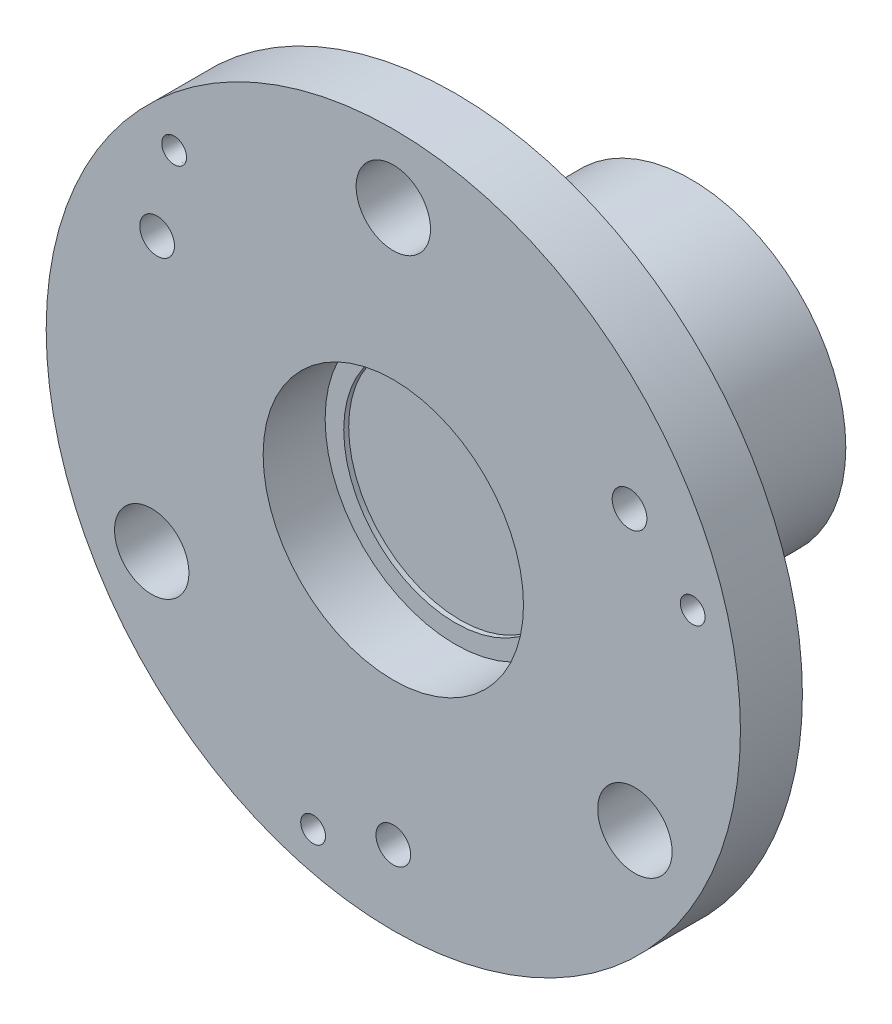
ISO-10303-21;
HEADER;
FILE_DESCRIPTION(('STEP AP214'),'2;1');
FILE_NAME('part.step','',(''),(''),'','','');
FILE_SCHEMA(('AUTOMOTIVE_DESIGN { 1 0 10303 214 1 1 1 1 }'));
ENDSEC;
DATA;
#1=APPLICATION_CONTEXT('core data for automotive mechanical design processes');
#2=APPLICATION_PROTOCOL_DEFINITION('international standard','automotive_design',2000,#1);
#3=PRODUCT_CONTEXT('',#1,'mechanical');
#4=PRODUCT('Part','Part','',(#3));
#5=PRODUCT_RELATED_PRODUCT_CATEGORY('part','',(#4));
#6=PRODUCT_DEFINITION_FORMATION('','',#4);
#7=PRODUCT_DEFINITION_CONTEXT('part definition',#1,'design');
#8=PRODUCT_DEFINITION('design','',#6,#7);
#9=PRODUCT_DEFINITION_SHAPE('','',#8);
#10=(LENGTH_UNIT() NAMED_UNIT(*) SI_UNIT(.MILLI.,.METRE.));
#11=(NAMED_UNIT(*) PLANE_ANGLE_UNIT() SI_UNIT($,.RADIAN.));
#12=(NAMED_UNIT(*) SI_UNIT($,.STERADIAN.) SOLID_ANGLE_UNIT());
#13=UNCERTAINTY_MEASURE_WITH_UNIT(LENGTH_MEASURE(1.E-05),#10,'distance_accuracy_value','');
#14=(GEOMETRIC_REPRESENTATION_CONTEXT(3) GLOBAL_UNCERTAINTY_ASSIGNED_CONTEXT((#13)) GLOBAL_UNIT_ASSIGNED_CONTEXT((#10,
#11,#12)) REPRESENTATION_CONTEXT('',''));
#15=CARTESIAN_POINT('',(0.,0.,0.));
#16=DIRECTION('',(0.,0.,1.));
#17=DIRECTION('',(1.,0.,0.));
#18=AXIS2_PLACEMENT_3D('',#15,#16,#17);
#19=CARTESIAN_POINT('',(0.,0.,-9.));
#20=DIRECTION('',(0.,0.,-1.));
#21=DIRECTION('',(0.,-1.,0.));
#22=AXIS2_PLACEMENT_3D('',#19,#20,#21);
#23=PLANE('',#22);
#24=CARTESIAN_POINT('',(0.,-7.,-9.));
#25=DIRECTION('',(0.,0.,-1.));
#26=DIRECTION('',(-1.,0.,0.));
#27=AXIS2_PLACEMENT_3D('',#24,#25,#26);
#28=CIRCLE('',#27,2.1);
#29=CARTESIAN_POINT('',(-2.1,-7.,-9.));
#30=VERTEX_POINT('',#29);
#31=EDGE_CURVE('E11',#30,#30,#28,.T.);
#32=ORIENTED_EDGE('',*,*,#31,.T.);
#33=EDGE_LOOP('',(#32));
#34=FACE_BOUND('',#33,.T.);
#35=ADVANCED_FACE('F17',(#34),#23,.T.);
#36=CARTESIAN_POINT('',(0.,-7.,-9.));
#37=DIRECTION('',(0.,0.,-1.));
#38=DIRECTION('',(-1.,0.,0.));
#39=AXIS2_PLACEMENT_3D('',#36,#37,#38);
#40=CYLINDRICAL_SURFACE('',#39,2.1);
#41=CARTESIAN_POINT('',(0.,-7.,-19.));
#42=DIRECTION('',(0.,0.,-1.));
#43=DIRECTION('',(-1.,0.,0.));
#44=AXIS2_PLACEMENT_3D('',#41,#42,#43);
#45=CIRCLE('',#44,2.1);
#46=CARTESIAN_POINT('',(-2.1,-7.,-19.));
#47=VERTEX_POINT('',#46);
#48=EDGE_CURVE('E274',#47,#47,#45,.T.);
#49=ORIENTED_EDGE('',*,*,#48,.T.);
#50=EDGE_LOOP('',(#49));
#51=FACE_BOUND('',#50,.T.);
#52=ORIENTED_EDGE('',*,*,#31,.F.);
#53=EDGE_LOOP('',(#52));
#54=FACE_BOUND('',#53,.T.);
#55=ADVANCED_FACE('F327',(#51,#54),#40,.F.);
#56=CARTESIAN_POINT('',(0.,0.,-9.));
#57=DIRECTION('',(0.,0.,-1.));
#58=DIRECTION('',(0.,-1.,0.));
#59=AXIS2_PLACEMENT_3D('',#56,#57,#58);
#60=PLANE('',#59);
#61=CARTESIAN_POINT('',(-7.,0.,-9.));
#62=DIRECTION('',(0.,0.,-1.));
#63=DIRECTION('',(-1.,0.,0.));
#64=AXIS2_PLACEMENT_3D('',#61,#62,#63);
#65=CIRCLE('',#64,2.1);
#66=CARTESIAN_POINT('',(-9.1,0.,-9.));
#67=VERTEX_POINT('',#66);
#68=EDGE_CURVE('E27',#67,#67,#65,.T.);
#69=ORIENTED_EDGE('',*,*,#68,.T.);
#70=EDGE_LOOP('',(#69));
#71=FACE_BOUND('',#70,.T.);
#72=ADVANCED_FACE('F333',(#71),#60,.T.);
#73=CARTESIAN_POINT('',(-7.,0.,-9.));
#74=DIRECTION('',(0.,0.,-1.));
#75=DIRECTION('',(-1.,0.,0.));
#76=AXIS2_PLACEMENT_3D('',#73,#74,#75);
#77=CYLINDRICAL_SURFACE('',#76,2.1);
#78=CARTESIAN_POINT('',(-7.,0.,-19.));
#79=DIRECTION('',(0.,0.,-1.));
#80=DIRECTION('',(-1.,0.,0.));
#81=AXIS2_PLACEMENT_3D('',#78,#79,#80);
#82=CIRCLE('',#81,2.1);
#83=CARTESIAN_POINT('',(-9.1,0.,-19.));
#84=VERTEX_POINT('',#83);
#85=EDGE_CURVE('E280',#84,#84,#82,.T.);
#86=ORIENTED_EDGE('',*,*,#85,.T.);
#87=EDGE_LOOP('',(#86));
#88=FACE_BOUND('',#87,.T.);
#89=ORIENTED_EDGE('',*,*,#68,.F.);
#90=EDGE_LOOP('',(#89));
#91=FACE_BOUND('',#90,.T.);
#92=ADVANCED_FACE('F552',(#88,#91),#77,.F.);
#93=CARTESIAN_POINT('',(0.,0.,-9.));
#94=DIRECTION('',(0.,0.,-1.));
#95=DIRECTION('',(0.,-1.,0.));
#96=AXIS2_PLACEMENT_3D('',#93,#94,#95);
#97=PLANE('',#96);
#98=CARTESIAN_POINT('',(0.,7.,-9.));
#99=DIRECTION('',(0.,0.,-1.));
#100=DIRECTION('',(-1.,0.,0.));
#101=AXIS2_PLACEMENT_3D('',#98,#99,#100);
#102=CIRCLE('',#101,2.1);
#103=CARTESIAN_POINT('',(-2.1,7.,-9.));
#104=VERTEX_POINT('',#103);
#105=EDGE_CURVE('E251',#104,#104,#102,.T.);
#106=ORIENTED_EDGE('',*,*,#105,.T.);
#107=EDGE_LOOP('',(#106));
#108=FACE_BOUND('',#107,.T.);
#109=ADVANCED_FACE('F573',(#108),#97,.T.);
#110=CARTESIAN_POINT('',(0.,7.,-9.));
#111=DIRECTION('',(0.,0.,-1.));
#112=DIRECTION('',(-1.,0.,0.));
#113=AXIS2_PLACEMENT_3D('',#110,#111,#112);
#114=CYLINDRICAL_SURFACE('',#113,2.1);
#115=CARTESIAN_POINT('',(0.,7.,-19.));
#116=DIRECTION('',(0.,0.,-1.));
#117=DIRECTION('',(-1.,0.,0.));
#118=AXIS2_PLACEMENT_3D('',#115,#116,#117);
#119=CIRCLE('',#118,2.1);
#120=CARTESIAN_POINT('',(-2.1,7.,-19.));
#121=VERTEX_POINT('',#120);
#122=EDGE_CURVE('E283',#121,#121,#119,.T.);
#123=ORIENTED_EDGE('',*,*,#122,.T.);
#124=EDGE_LOOP('',(#123));
#125=FACE_BOUND('',#124,.T.);
#126=ORIENTED_EDGE('',*,*,#105,.F.);
#127=EDGE_LOOP('',(#126));
#128=FACE_BOUND('',#127,.T.);
#129=ADVANCED_FACE('F393',(#125,#128),#114,.F.);
#130=CARTESIAN_POINT('',(0.,0.,-9.));
#131=DIRECTION('',(0.,0.,-1.));
#132=DIRECTION('',(0.,-1.,0.));
#133=AXIS2_PLACEMENT_3D('',#130,#131,#132);
#134=PLANE('',#133);
#135=CARTESIAN_POINT('',(7.,0.,-9.));
#136=DIRECTION('',(0.,0.,-1.));
#137=DIRECTION('',(-1.,0.,0.));
#138=AXIS2_PLACEMENT_3D('',#135,#136,#137);
#139=CIRCLE('',#138,2.1);
#140=CARTESIAN_POINT('',(4.9,0.,-9.));
#141=VERTEX_POINT('',#140);
#142=EDGE_CURVE('E877',#141,#141,#139,.T.);
#143=ORIENTED_EDGE('',*,*,#142,.T.);
#144=EDGE_LOOP('',(#143));
#145=FACE_BOUND('',#144,.T.);
#146=ADVANCED_FACE('F537',(#145),#134,.T.);
#147=CARTESIAN_POINT('',(7.,0.,-9.));
#148=DIRECTION('',(0.,0.,-1.));
#149=DIRECTION('',(-1.,0.,0.));
#150=AXIS2_PLACEMENT_3D('',#147,#148,#149);
#151=CYLINDRICAL_SURFACE('',#150,2.1);
#152=CARTESIAN_POINT('',(7.,0.,-19.));
#153=DIRECTION('',(0.,0.,-1.));
#154=DIRECTION('',(-1.,0.,0.));
#155=AXIS2_PLACEMENT_3D('',#152,#153,#154);
#156=CIRCLE('',#155,2.1);
#157=CARTESIAN_POINT('',(4.9,0.,-19.));
#158=VERTEX_POINT('',#157);
#159=EDGE_CURVE('E424',#158,#158,#156,.T.);
#160=ORIENTED_EDGE('',*,*,#159,.T.);
#161=EDGE_LOOP('',(#160));
#162=FACE_BOUND('',#161,.T.);
#163=ORIENTED_EDGE('',*,*,#142,.F.);
#164=EDGE_LOOP('',(#163));
#165=FACE_BOUND('',#164,.T.);
#166=ADVANCED_FACE('F532',(#162,#165),#151,.F.);
#167=CARTESIAN_POINT('',(0.,0.,-19.));
#168=DIRECTION('',(0.,0.,-1.));
#169=DIRECTION('',(0.,-1.,0.));
#170=AXIS2_PLACEMENT_3D('',#167,#168,#169);
#171=PLANE('',#170);
#172=CARTESIAN_POINT('',(0.,0.,-19.));
#173=DIRECTION('',(0.,0.,-1.));
#174=DIRECTION('',(-1.,0.,0.));
#175=AXIS2_PLACEMENT_3D('',#172,#173,#174);
#176=CIRCLE('',#175,12.5);
#177=CARTESIAN_POINT('',(-12.5,0.,-19.));
#178=VERTEX_POINT('',#177);
#179=EDGE_CURVE('E257',#178,#178,#176,.T.);
#180=ORIENTED_EDGE('',*,*,#179,.T.);
#181=EDGE_LOOP('',(#180));
#182=FACE_BOUND('',#181,.T.);
#183=ORIENTED_EDGE('',*,*,#159,.F.);
#184=EDGE_LOOP('',(#183));
#185=FACE_BOUND('',#184,.T.);
#186=ORIENTED_EDGE('',*,*,#122,.F.);
#187=EDGE_LOOP('',(#186));
#188=FACE_BOUND('',#187,.T.);
#189=ORIENTED_EDGE('',*,*,#85,.F.);
#190=EDGE_LOOP('',(#189));
#191=FACE_BOUND('',#190,.T.);
#192=ORIENTED_EDGE('',*,*,#48,.F.);
#193=EDGE_LOOP('',(#192));
#194=FACE_BOUND('',#193,.T.);
#195=ADVANCED_FACE('F379',(#182,#185,#188,#191,#194),#171,.T.);
#196=CARTESIAN_POINT('',(0.,0.,-19.));
#197=DIRECTION('',(0.,0.,1.));
#198=DIRECTION('',(1.,0.,0.));
#199=AXIS2_PLACEMENT_3D('',#196,#197,#198);
#200=CYLINDRICAL_SURFACE('',#199,12.5);
#201=CARTESIAN_POINT('',(0.,0.,-4.));
#202=DIRECTION('',(0.,0.,-1.));
#203=DIRECTION('',(-1.,0.,0.));
#204=AXIS2_PLACEMENT_3D('',#201,#202,#203);
#205=CIRCLE('',#204,12.5);
#206=CARTESIAN_POINT('',(-12.5,0.,-4.));
#207=VERTEX_POINT('',#206);
#208=EDGE_CURVE('E220',#207,#207,#205,.T.);
#209=ORIENTED_EDGE('',*,*,#208,.T.);
#210=EDGE_LOOP('',(#209));
#211=FACE_BOUND('',#210,.T.);
#212=ORIENTED_EDGE('',*,*,#179,.F.);
#213=EDGE_LOOP('',(#212));
#214=FACE_BOUND('',#213,.T.);
#215=ADVANCED_FACE('F221',(#211,#214),#200,.T.);
#216=CARTESIAN_POINT('',(0.,0.,-0.4));
#217=DIRECTION('',(0.,0.,1.));
#218=DIRECTION('',(1.,0.,0.));
#219=AXIS2_PLACEMENT_3D('',#216,#217,#218);
#220=PLANE('',#219);
#221=CARTESIAN_POINT('',(0.,0.,-0.4));
#222=DIRECTION('',(0.,0.,-1.));
#223=DIRECTION('',(1.,0.,0.));
#224=AXIS2_PLACEMENT_3D('',#221,#222,#223);
#225=CIRCLE('',#224,9.);
#226=CARTESIAN_POINT('',(9.,0.,-0.4));
#227=VERTEX_POINT('',#226);
#228=EDGE_CURVE('E254',#227,#227,#225,.T.);
#229=ORIENTED_EDGE('',*,*,#228,.F.);
#230=EDGE_LOOP('',(#229));
#231=FACE_BOUND('',#230,.T.);
#232=ADVANCED_FACE('F362',(#231),#220,.T.);
#233=CARTESIAN_POINT('',(0.,0.,0.));
#234=DIRECTION('',(0.,0.,1.));
#235=DIRECTION('',(1.,0.,0.));
#236=AXIS2_PLACEMENT_3D('',#233,#234,#235);
#237=PLANE('',#236);
#238=CARTESIAN_POINT('',(0.,0.,0.));
#239=DIRECTION('',(0.,0.,1.));
#240=DIRECTION('',(1.,0.,0.));
#241=AXIS2_PLACEMENT_3D('',#238,#239,#240);
#242=CIRCLE('',#241,10.5);
#243=CARTESIAN_POINT('',(10.5,0.,0.));
#244=VERTEX_POINT('',#243);
#245=EDGE_CURVE('E213',#244,#244,#242,.T.);
#246=ORIENTED_EDGE('',*,*,#245,.T.);
#247=EDGE_LOOP('',(#246));
#248=FACE_BOUND('',#247,.T.);
#249=CARTESIAN_POINT('',(0.,0.,0.));
#250=DIRECTION('',(0.,0.,1.));
#251=DIRECTION('',(1.,0.,0.));
#252=AXIS2_PLACEMENT_3D('',#249,#250,#251);
#253=CIRCLE('',#252,9.);
#254=CARTESIAN_POINT('',(9.,0.,0.));
#255=VERTEX_POINT('',#254);
#256=EDGE_CURVE('E231',#255,#255,#253,.T.);
#257=ORIENTED_EDGE('',*,*,#256,.F.);
#258=EDGE_LOOP('',(#257));
#259=FACE_BOUND('',#258,.T.);
#260=ADVANCED_FACE('F321',(#248,#259),#237,.T.);
#261=CARTESIAN_POINT('',(0.,0.,0.));
#262=DIRECTION('',(0.,0.,-1.));
#263=DIRECTION('',(-1.,0.,0.));
#264=AXIS2_PLACEMENT_3D('',#261,#262,#263);
#265=CYLINDRICAL_SURFACE('',#264,9.);
#266=ORIENTED_EDGE('',*,*,#228,.T.);
#267=EDGE_LOOP('',(#266));
#268=FACE_BOUND('',#267,.T.);
#269=ORIENTED_EDGE('',*,*,#256,.T.);
#270=EDGE_LOOP('',(#269));
#271=FACE_BOUND('',#270,.T.);
#272=ADVANCED_FACE('F310',(#268,#271),#265,.F.);
#273=CARTESIAN_POINT('',(0.,0.,-2.));
#274=DIRECTION('',(0.,0.,1.));
#275=DIRECTION('',(1.,0.,0.));
#276=AXIS2_PLACEMENT_3D('',#273,#274,#275);
#277=CONICAL_SURFACE('',#276,14.5,0.785398163397448);
#278=CARTESIAN_POINT('',(0.,0.,-2.));
#279=DIRECTION('',(0.,0.,-1.));
#280=DIRECTION('',(1.,0.,0.));
#281=AXIS2_PLACEMENT_3D('',#278,#279,#280);
#282=CIRCLE('',#281,14.5);
#283=CARTESIAN_POINT('',(14.5,0.,-2.));
#284=VERTEX_POINT('',#283);
#285=EDGE_CURVE('E141',#284,#284,#282,.T.);
#286=ORIENTED_EDGE('',*,*,#285,.F.);
#287=EDGE_LOOP('',(#286));
#288=FACE_BOUND('',#287,.T.);
#289=CARTESIAN_POINT('',(0.,0.,0.));
#290=DIRECTION('',(0.,0.,1.));
#291=DIRECTION('',(1.,0.,0.));
#292=AXIS2_PLACEMENT_3D('',#289,#290,#291);
#293=CIRCLE('',#292,16.5);
#294=CARTESIAN_POINT('',(16.5,0.,0.));
#295=VERTEX_POINT('',#294);
#296=EDGE_CURVE('E291',#295,#295,#293,.T.);
#297=ORIENTED_EDGE('',*,*,#296,.F.);
#298=EDGE_LOOP('',(#297));
#299=FACE_BOUND('',#298,.T.);
#300=ADVANCED_FACE('F307',(#288,#299),#277,.T.);
#301=CARTESIAN_POINT('',(0.,0.,-0.4));
#302=DIRECTION('',(0.,0.,1.));
#303=DIRECTION('',(1.,0.,0.));
#304=AXIS2_PLACEMENT_3D('',#301,#302,#303);
#305=CYLINDRICAL_SURFACE('',#304,10.5);
#306=CARTESIAN_POINT('',(0.,0.,5.));
#307=DIRECTION('',(0.,0.,1.));
#308=DIRECTION('',(1.,0.,0.));
#309=AXIS2_PLACEMENT_3D('',#306,#307,#308);
#310=CIRCLE('',#309,10.5);
#311=CARTESIAN_POINT('',(10.5,0.,5.));
#312=VERTEX_POINT('',#311);
#313=EDGE_CURVE('E79',#312,#312,#310,.T.);
#314=ORIENTED_EDGE('',*,*,#313,.T.);
#315=EDGE_LOOP('',(#314));
#316=FACE_BOUND('',#315,.T.);
#317=ORIENTED_EDGE('',*,*,#245,.F.);
#318=EDGE_LOOP('',(#317));
#319=FACE_BOUND('',#318,.T.);
#320=ADVANCED_FACE('F309',(#316,#319),#305,.F.);
#321=CARTESIAN_POINT('',(0.,0.,-4.));
#322=DIRECTION('',(0.,0.,-1.));
#323=DIRECTION('',(0.,-1.,0.));
#324=AXIS2_PLACEMENT_3D('',#321,#322,#323);
#325=PLANE('',#324);
#326=CARTESIAN_POINT('',(0.,0.,-4.));
#327=DIRECTION('',(0.,0.,-1.));
#328=DIRECTION('',(-1.,0.,0.));
#329=AXIS2_PLACEMENT_3D('',#326,#327,#328);
#330=CIRCLE('',#329,14.5);
#331=CARTESIAN_POINT('',(-14.5,0.,-4.));
#332=VERTEX_POINT('',#331);
#333=EDGE_CURVE('E21',#332,#332,#330,.T.);
#334=ORIENTED_EDGE('',*,*,#333,.T.);
#335=EDGE_LOOP('',(#334));
#336=FACE_BOUND('',#335,.T.);
#337=ORIENTED_EDGE('',*,*,#208,.F.);
#338=EDGE_LOOP('',(#337));
#339=FACE_BOUND('',#338,.T.);
#340=ADVANCED_FACE('F319',(#336,#339),#325,.T.);
#341=CARTESIAN_POINT('',(0.,0.,-4.));
#342=DIRECTION('',(0.,0.,1.));
#343=DIRECTION('',(1.,0.,0.));
#344=AXIS2_PLACEMENT_3D('',#341,#342,#343);
#345=CYLINDRICAL_SURFACE('',#344,14.5);
#346=ORIENTED_EDGE('',*,*,#333,.F.);
#347=EDGE_LOOP('',(#346));
#348=FACE_BOUND('',#347,.T.);
#349=ORIENTED_EDGE('',*,*,#285,.T.);
#350=EDGE_LOOP('',(#349));
#351=FACE_BOUND('',#350,.T.);
#352=ADVANCED_FACE('F360',(#348,#351),#345,.T.);
#353=CARTESIAN_POINT('',(3.23523806378151,-4.66116523516815,2.8));
#354=DIRECTION('',(0.,0.,-1.));
#355=DIRECTION('',(0.,-1.,0.));
#356=AXIS2_PLACEMENT_3D('',#353,#354,#355);
#357=PLANE('',#356);
#358=CARTESIAN_POINT('',(-17.6776695296637,17.6776695296637,2.8));
#359=DIRECTION('',(0.,0.,-1.));
#360=DIRECTION('',(-1.,0.,0.));
#361=AXIS2_PLACEMENT_3D('',#358,#359,#360);
#362=CIRCLE('',#361,0.532375564325952);
#363=CARTESIAN_POINT('',(-18.2100450939897,17.6776695296637,2.8));
#364=VERTEX_POINT('',#363);
#365=EDGE_CURVE('E154',#364,#364,#362,.T.);
#366=ORIENTED_EDGE('',*,*,#365,.F.);
#367=EDGE_LOOP('',(#366));
#368=FACE_BOUND('',#367,.T.);
#369=ADVANCED_FACE('F356',(#368),#357,.F.);
#370=CARTESIAN_POINT('',(-17.6776695296637,17.6776695296637,5.));
#371=DIRECTION('',(0.,0.,1.));
#372=DIRECTION('',(-1.,0.,0.));
#373=AXIS2_PLACEMENT_3D('',#370,#371,#372);
#374=CONICAL_SURFACE('',#373,1.,0.20943951023932);
#375=CARTESIAN_POINT('',(-17.6776695296637,17.6776695296637,5.));
#376=DIRECTION('',(0.,0.,-1.));
#377=DIRECTION('',(-1.,0.,0.));
#378=AXIS2_PLACEMENT_3D('',#375,#376,#377);
#379=CIRCLE('',#378,1.);
#380=CARTESIAN_POINT('',(-18.6776695296637,17.6776695296637,5.));
#381=VERTEX_POINT('',#380);
#382=EDGE_CURVE('E69',#381,#381,#379,.T.);
#383=ORIENTED_EDGE('',*,*,#382,.F.);
#384=EDGE_LOOP('',(#383));
#385=FACE_BOUND('',#384,.T.);
#386=ORIENTED_EDGE('',*,*,#365,.T.);
#387=EDGE_LOOP('',(#386));
#388=FACE_BOUND('',#387,.T.);
#389=ADVANCED_FACE('F359',(#385,#388),#374,.F.);
#390=CARTESIAN_POINT('',(3.23523806378151,-4.66116523516815,2.8));
#391=DIRECTION('',(0.,0.,-1.));
#392=DIRECTION('',(0.,-1.,0.));
#393=AXIS2_PLACEMENT_3D('',#390,#391,#392);
#394=PLANE('',#393);
#395=CARTESIAN_POINT('',(24.1481456572267,6.47047612756302,2.8));
#396=DIRECTION('',(0.,0.,-1.));
#397=DIRECTION('',(-1.,0.,0.));
#398=AXIS2_PLACEMENT_3D('',#395,#396,#397);
#399=CIRCLE('',#398,0.532375564325951);
#400=CARTESIAN_POINT('',(23.6157700929007,6.47047612756302,2.8));
#401=VERTEX_POINT('',#400);
#402=EDGE_CURVE('E269',#401,#401,#399,.T.);
#403=ORIENTED_EDGE('',*,*,#402,.F.);
#404=EDGE_LOOP('',(#403));
#405=FACE_BOUND('',#404,.T.);
#406=ADVANCED_FACE('F354',(#405),#394,.F.);
#407=CARTESIAN_POINT('',(24.1481456572267,6.47047612756302,5.));
#408=DIRECTION('',(0.,0.,1.));
#409=DIRECTION('',(-1.,0.,0.));
#410=AXIS2_PLACEMENT_3D('',#407,#408,#409);
#411=CONICAL_SURFACE('',#410,1.,0.20943951023932);
#412=CARTESIAN_POINT('',(24.1481456572267,6.47047612756302,5.));
#413=DIRECTION('',(0.,0.,-1.));
#414=DIRECTION('',(-1.,0.,0.));
#415=AXIS2_PLACEMENT_3D('',#412,#413,#414);
#416=CIRCLE('',#415,1.);
#417=CARTESIAN_POINT('',(23.1481456572267,6.47047612756302,5.));
#418=VERTEX_POINT('',#417);
#419=EDGE_CURVE('E58',#418,#418,#416,.T.);
#420=ORIENTED_EDGE('',*,*,#419,.F.);
#421=EDGE_LOOP('',(#420));
#422=FACE_BOUND('',#421,.T.);
#423=ORIENTED_EDGE('',*,*,#402,.T.);
#424=EDGE_LOOP('',(#423));
#425=FACE_BOUND('',#424,.T.);
#426=ADVANCED_FACE('F351',(#422,#425),#411,.F.);
#427=CARTESIAN_POINT('',(3.23523806378151,-4.66116523516815,2.8));
#428=DIRECTION('',(0.,0.,-1.));
#429=DIRECTION('',(0.,-1.,0.));
#430=AXIS2_PLACEMENT_3D('',#427,#428,#429);
#431=PLANE('',#430);
#432=CARTESIAN_POINT('',(-6.47047612756302,-24.1481456572267,2.8));
#433=DIRECTION('',(0.,0.,-1.));
#434=DIRECTION('',(-1.,0.,0.));
#435=AXIS2_PLACEMENT_3D('',#432,#433,#434);
#436=CIRCLE('',#435,0.532375564325951);
#437=CARTESIAN_POINT('',(-7.00285169188897,-24.1481456572267,2.8));
#438=VERTEX_POINT('',#437);
#439=EDGE_CURVE('E266',#438,#438,#436,.T.);
#440=ORIENTED_EDGE('',*,*,#439,.F.);
#441=EDGE_LOOP('',(#440));
#442=FACE_BOUND('',#441,.T.);
#443=ADVANCED_FACE('F19',(#442),#431,.F.);
#444=CARTESIAN_POINT('',(-6.47047612756302,-24.1481456572267,5.));
#445=DIRECTION('',(0.,0.,1.));
#446=DIRECTION('',(-1.,0.,0.));
#447=AXIS2_PLACEMENT_3D('',#444,#445,#446);
#448=CONICAL_SURFACE('',#447,1.,0.20943951023932);
#449=CARTESIAN_POINT('',(-6.47047612756302,-24.1481456572267,5.));
#450=DIRECTION('',(0.,0.,-1.));
#451=DIRECTION('',(-1.,0.,0.));
#452=AXIS2_PLACEMENT_3D('',#449,#450,#451);
#453=CIRCLE('',#452,1.);
#454=CARTESIAN_POINT('',(-7.47047612756302,-24.1481456572267,5.));
#455=VERTEX_POINT('',#454);
#456=EDGE_CURVE('E236',#455,#455,#453,.T.);
#457=ORIENTED_EDGE('',*,*,#456,.F.);
#458=EDGE_LOOP('',(#457));
#459=FACE_BOUND('',#458,.T.);
#460=ORIENTED_EDGE('',*,*,#439,.T.);
#461=EDGE_LOOP('',(#460));
#462=FACE_BOUND('',#461,.T.);
#463=ADVANCED_FACE('F447',(#459,#462),#448,.F.);
#464=CARTESIAN_POINT('',(19.0525588832577,11.,0.));
#465=DIRECTION('',(0.,0.,-1.));
#466=DIRECTION('',(-1.,0.,0.));
#467=AXIS2_PLACEMENT_3D('',#464,#465,#466);
#468=CONICAL_SURFACE('',#467,3.75,0.785398163397448);
#469=CARTESIAN_POINT('',(19.0525588832577,11.,0.));
#470=DIRECTION('',(0.,0.,1.));
#471=DIRECTION('',(1.,0.,0.));
#472=AXIS2_PLACEMENT_3D('',#469,#470,#471);
#473=CIRCLE('',#472,3.75);
#474=CARTESIAN_POINT('',(22.8025588832577,11.,0.));
#475=VERTEX_POINT('',#474);
#476=EDGE_CURVE('E248',#475,#475,#473,.T.);
#477=ORIENTED_EDGE('',*,*,#476,.F.);
#478=EDGE_LOOP('',(#477));
#479=FACE_BOUND('',#478,.T.);
#480=CARTESIAN_POINT('',(19.0525588832577,11.,2.35));
#481=DIRECTION('',(0.,0.,1.));
#482=DIRECTION('',(1.,0.,0.));
#483=AXIS2_PLACEMENT_3D('',#480,#481,#482);
#484=CIRCLE('',#483,1.4);
#485=CARTESIAN_POINT('',(20.4525588832577,11.,2.35));
#486=VERTEX_POINT('',#485);
#487=EDGE_CURVE('E270',#486,#486,#484,.T.);
#488=ORIENTED_EDGE('',*,*,#487,.T.);
#489=EDGE_LOOP('',(#488));
#490=FACE_BOUND('',#489,.T.);
#491=ADVANCED_FACE('F401',(#479,#490),#468,.F.);
#492=CARTESIAN_POINT('',(19.0525588832577,11.,0.));
#493=DIRECTION('',(0.,0.,1.));
#494=DIRECTION('',(1.,0.,0.));
#495=AXIS2_PLACEMENT_3D('',#492,#493,#494);
#496=CYLINDRICAL_SURFACE('',#495,1.4);
#497=ORIENTED_EDGE('',*,*,#487,.F.);
#498=EDGE_LOOP('',(#497));
#499=FACE_BOUND('',#498,.T.);
#500=CARTESIAN_POINT('',(19.0525588832577,11.,5.));
#501=DIRECTION('',(0.,0.,-1.));
#502=DIRECTION('',(1.,0.,0.));
#503=AXIS2_PLACEMENT_3D('',#500,#501,#502);
#504=CIRCLE('',#503,1.4);
#505=CARTESIAN_POINT('',(20.4525588832577,11.,5.));
#506=VERTEX_POINT('',#505);
#507=EDGE_CURVE('E239',#506,#506,#504,.T.);
#508=ORIENTED_EDGE('',*,*,#507,.F.);
#509=EDGE_LOOP('',(#508));
#510=FACE_BOUND('',#509,.T.);
#511=ADVANCED_FACE('F395',(#499,#510),#496,.F.);
#512=CARTESIAN_POINT('',(-19.0525588832577,11.,0.));
#513=DIRECTION('',(0.,0.,-1.));
#514=DIRECTION('',(-1.,0.,0.));
#515=AXIS2_PLACEMENT_3D('',#512,#513,#514);
#516=CONICAL_SURFACE('',#515,3.75,0.785398163397448);
#517=CARTESIAN_POINT('',(-19.0525588832577,11.,0.));
#518=DIRECTION('',(0.,0.,1.));
#519=DIRECTION('',(1.,0.,0.));
#520=AXIS2_PLACEMENT_3D('',#517,#518,#519);
#521=CIRCLE('',#520,3.75);
#522=CARTESIAN_POINT('',(-15.3025588832577,11.,0.));
#523=VERTEX_POINT('',#522);
#524=EDGE_CURVE('E244',#523,#523,#521,.T.);
#525=ORIENTED_EDGE('',*,*,#524,.F.);
#526=EDGE_LOOP('',(#525));
#527=FACE_BOUND('',#526,.T.);
#528=CARTESIAN_POINT('',(-19.0525588832577,11.,2.35));
#529=DIRECTION('',(0.,0.,1.));
#530=DIRECTION('',(1.,0.,0.));
#531=AXIS2_PLACEMENT_3D('',#528,#529,#530);
#532=CIRCLE('',#531,1.4);
#533=CARTESIAN_POINT('',(-17.6525588832577,11.,2.35));
#534=VERTEX_POINT('',#533);
#535=EDGE_CURVE('E287',#534,#534,#532,.T.);
#536=ORIENTED_EDGE('',*,*,#535,.T.);
#537=EDGE_LOOP('',(#536));
#538=FACE_BOUND('',#537,.T.);
#539=ADVANCED_FACE('F343',(#527,#538),#516,.F.);
#540=CARTESIAN_POINT('',(-19.0525588832577,11.,0.));
#541=DIRECTION('',(0.,0.,1.));
#542=DIRECTION('',(1.,0.,0.));
#543=AXIS2_PLACEMENT_3D('',#540,#541,#542);
#544=CYLINDRICAL_SURFACE('',#543,1.4);
#545=ORIENTED_EDGE('',*,*,#535,.F.);
#546=EDGE_LOOP('',(#545));
#547=FACE_BOUND('',#546,.T.);
#548=CARTESIAN_POINT('',(-19.0525588832577,11.,5.));
#549=DIRECTION('',(0.,0.,-1.));
#550=DIRECTION('',(1.,0.,0.));
#551=AXIS2_PLACEMENT_3D('',#548,#549,#550);
#552=CIRCLE('',#551,1.4);
#553=CARTESIAN_POINT('',(-17.6525588832577,11.,5.));
#554=VERTEX_POINT('',#553);
#555=EDGE_CURVE('E292',#554,#554,#552,.T.);
#556=ORIENTED_EDGE('',*,*,#555,.F.);
#557=EDGE_LOOP('',(#556));
#558=FACE_BOUND('',#557,.T.);
#559=ADVANCED_FACE('F339',(#547,#558),#544,.F.);
#560=CARTESIAN_POINT('',(0.,-22.,0.));
#561=DIRECTION('',(0.,0.,-1.));
#562=DIRECTION('',(-1.,0.,0.));
#563=AXIS2_PLACEMENT_3D('',#560,#561,#562);
#564=CONICAL_SURFACE('',#563,3.75,0.785398163397448);
#565=CARTESIAN_POINT('',(0.,-22.,0.));
#566=DIRECTION('',(0.,0.,1.));
#567=DIRECTION('',(1.,0.,0.));
#568=AXIS2_PLACEMENT_3D('',#565,#566,#567);
#569=CIRCLE('',#568,3.75);
#570=CARTESIAN_POINT('',(3.75,-22.,0.));
#571=VERTEX_POINT('',#570);
#572=EDGE_CURVE('E247',#571,#571,#569,.T.);
#573=ORIENTED_EDGE('',*,*,#572,.F.);
#574=EDGE_LOOP('',(#573));
#575=FACE_BOUND('',#574,.T.);
#576=CARTESIAN_POINT('',(0.,-22.,2.35));
#577=DIRECTION('',(0.,0.,1.));
#578=DIRECTION('',(1.,0.,0.));
#579=AXIS2_PLACEMENT_3D('',#576,#577,#578);
#580=CIRCLE('',#579,1.4);
#581=CARTESIAN_POINT('',(1.4,-22.,2.35));
#582=VERTEX_POINT('',#581);
#583=EDGE_CURVE('E284',#582,#582,#580,.T.);
#584=ORIENTED_EDGE('',*,*,#583,.T.);
#585=EDGE_LOOP('',(#584));
#586=FACE_BOUND('',#585,.T.);
#587=ADVANCED_FACE('F342',(#575,#586),#564,.F.);
#588=CARTESIAN_POINT('',(0.,-22.,0.));
#589=DIRECTION('',(0.,0.,1.));
#590=DIRECTION('',(1.,0.,0.));
#591=AXIS2_PLACEMENT_3D('',#588,#589,#590);
#592=CYLINDRICAL_SURFACE('',#591,1.4);
#593=ORIENTED_EDGE('',*,*,#583,.F.);
#594=EDGE_LOOP('',(#593));
#595=FACE_BOUND('',#594,.T.);
#596=CARTESIAN_POINT('',(0.,-22.,5.));
#597=DIRECTION('',(0.,0.,-1.));
#598=DIRECTION('',(1.,0.,0.));
#599=AXIS2_PLACEMENT_3D('',#596,#597,#598);
#600=CIRCLE('',#599,1.4);
#601=CARTESIAN_POINT('',(1.4,-22.,5.));
#602=VERTEX_POINT('',#601);
#603=EDGE_CURVE('E288',#602,#602,#600,.T.);
#604=ORIENTED_EDGE('',*,*,#603,.F.);
#605=EDGE_LOOP('',(#604));
#606=FACE_BOUND('',#605,.T.);
#607=ADVANCED_FACE('F366',(#595,#606),#592,.F.);
#608=CARTESIAN_POINT('',(0.,0.,0.));
#609=DIRECTION('',(0.,0.,1.));
#610=DIRECTION('',(1.,0.,0.));
#611=AXIS2_PLACEMENT_3D('',#608,#609,#610);
#612=PLANE('',#611);
#613=CARTESIAN_POINT('',(0.,0.,0.));
#614=DIRECTION('',(0.,0.,1.));
#615=DIRECTION('',(1.,0.,0.));
#616=AXIS2_PLACEMENT_3D('',#613,#614,#615);
#617=CIRCLE('',#616,28.);
#618=CARTESIAN_POINT('',(28.,0.,0.));
#619=VERTEX_POINT('',#618);
#620=EDGE_CURVE('E240',#619,#619,#617,.T.);
#621=ORIENTED_EDGE('',*,*,#620,.F.);
#622=EDGE_LOOP('',(#621));
#623=FACE_BOUND('',#622,.T.);
#624=CARTESIAN_POINT('',(-19.4855715851498,-11.25,0.));
#625=DIRECTION('',(0.,0.,1.));
#626=DIRECTION('',(1.,0.,0.));
#627=AXIS2_PLACEMENT_3D('',#624,#625,#626);
#628=CIRCLE('',#627,3.);
#629=CARTESIAN_POINT('',(-16.4855715851498,-11.25,0.));
#630=VERTEX_POINT('',#629);
#631=EDGE_CURVE('E276',#630,#630,#628,.T.);
#632=ORIENTED_EDGE('',*,*,#631,.T.);
#633=EDGE_LOOP('',(#632));
#634=FACE_BOUND('',#633,.T.);
#635=CARTESIAN_POINT('',(19.4855715851498,-11.25,0.));
#636=DIRECTION('',(0.,0.,1.));
#637=DIRECTION('',(1.,0.,0.));
#638=AXIS2_PLACEMENT_3D('',#635,#636,#637);
#639=CIRCLE('',#638,3.);
#640=CARTESIAN_POINT('',(22.4855715851498,-11.25,0.));
#641=VERTEX_POINT('',#640);
#642=EDGE_CURVE('E258',#641,#641,#639,.T.);
#643=ORIENTED_EDGE('',*,*,#642,.T.);
#644=EDGE_LOOP('',(#643));
#645=FACE_BOUND('',#644,.T.);
#646=CARTESIAN_POINT('',(0.,22.5,0.));
#647=DIRECTION('',(0.,0.,1.));
#648=DIRECTION('',(1.,0.,0.));
#649=AXIS2_PLACEMENT_3D('',#646,#647,#648);
#650=CIRCLE('',#649,3.);
#651=CARTESIAN_POINT('',(3.,22.5,0.));
#652=VERTEX_POINT('',#651);
#653=EDGE_CURVE('E265',#652,#652,#650,.T.);
#654=ORIENTED_EDGE('',*,*,#653,.T.);
#655=EDGE_LOOP('',(#654));
#656=FACE_BOUND('',#655,.T.);
#657=ORIENTED_EDGE('',*,*,#572,.T.);
#658=EDGE_LOOP('',(#657));
#659=FACE_BOUND('',#658,.T.);
#660=ORIENTED_EDGE('',*,*,#524,.T.);
#661=EDGE_LOOP('',(#660));
#662=FACE_BOUND('',#661,.T.);
#663=ORIENTED_EDGE('',*,*,#476,.T.);
#664=EDGE_LOOP('',(#663));
#665=FACE_BOUND('',#664,.T.);
#666=ORIENTED_EDGE('',*,*,#296,.T.);
#667=EDGE_LOOP('',(#666));
#668=FACE_BOUND('',#667,.T.);
#669=ADVANCED_FACE('F305',(#623,#634,#645,#656,#659,#662,#665,#668),#612,.F.);
#670=CARTESIAN_POINT('',(0.,0.,5.));
#671=DIRECTION('',(0.,0.,1.));
#672=DIRECTION('',(1.,0.,0.));
#673=AXIS2_PLACEMENT_3D('',#670,#671,#672);
#674=PLANE('',#673);
#675=CARTESIAN_POINT('',(0.,0.,5.));
#676=DIRECTION('',(0.,0.,1.));
#677=DIRECTION('',(1.,0.,0.));
#678=AXIS2_PLACEMENT_3D('',#675,#676,#677);
#679=CIRCLE('',#678,28.);
#680=CARTESIAN_POINT('',(28.,0.,5.));
#681=VERTEX_POINT('',#680);
#682=EDGE_CURVE('E243',#681,#681,#679,.T.);
#683=ORIENTED_EDGE('',*,*,#682,.T.);
#684=EDGE_LOOP('',(#683));
#685=FACE_BOUND('',#684,.T.);
#686=CARTESIAN_POINT('',(-19.4855715851498,-11.25,5.));
#687=DIRECTION('',(0.,0.,1.));
#688=DIRECTION('',(1.,0.,0.));
#689=AXIS2_PLACEMENT_3D('',#686,#687,#688);
#690=CIRCLE('',#689,3.);
#691=CARTESIAN_POINT('',(-16.4855715851498,-11.25,5.));
#692=VERTEX_POINT('',#691);
#693=EDGE_CURVE('E279',#692,#692,#690,.T.);
#694=ORIENTED_EDGE('',*,*,#693,.F.);
#695=EDGE_LOOP('',(#694));
#696=FACE_BOUND('',#695,.T.);
#697=CARTESIAN_POINT('',(19.4855715851498,-11.25,5.));
#698=DIRECTION('',(0.,0.,1.));
#699=DIRECTION('',(1.,0.,0.));
#700=AXIS2_PLACEMENT_3D('',#697,#698,#699);
#701=CIRCLE('',#700,3.);
#702=CARTESIAN_POINT('',(22.4855715851498,-11.25,5.));
#703=VERTEX_POINT('',#702);
#704=EDGE_CURVE('E262',#703,#703,#701,.T.);
#705=ORIENTED_EDGE('',*,*,#704,.F.);
#706=EDGE_LOOP('',(#705));
#707=FACE_BOUND('',#706,.T.);
#708=CARTESIAN_POINT('',(0.,22.5,5.));
#709=DIRECTION('',(0.,0.,1.));
#710=DIRECTION('',(1.,0.,0.));
#711=AXIS2_PLACEMENT_3D('',#708,#709,#710);
#712=CIRCLE('',#711,3.);
#713=CARTESIAN_POINT('',(3.,22.5,5.));
#714=VERTEX_POINT('',#713);
#715=EDGE_CURVE('E261',#714,#714,#712,.T.);
#716=ORIENTED_EDGE('',*,*,#715,.F.);
#717=EDGE_LOOP('',(#716));
#718=FACE_BOUND('',#717,.T.);
#719=ORIENTED_EDGE('',*,*,#603,.T.);
#720=EDGE_LOOP('',(#719));
#721=FACE_BOUND('',#720,.T.);
#722=ORIENTED_EDGE('',*,*,#555,.T.);
#723=EDGE_LOOP('',(#722));
#724=FACE_BOUND('',#723,.T.);
#725=ORIENTED_EDGE('',*,*,#507,.T.);
#726=EDGE_LOOP('',(#725));
#727=FACE_BOUND('',#726,.T.);
#728=ORIENTED_EDGE('',*,*,#456,.T.);
#729=EDGE_LOOP('',(#728));
#730=FACE_BOUND('',#729,.T.);
#731=ORIENTED_EDGE('',*,*,#419,.T.);
#732=EDGE_LOOP('',(#731));
#733=FACE_BOUND('',#732,.T.);
#734=ORIENTED_EDGE('',*,*,#382,.T.);
#735=EDGE_LOOP('',(#734));
#736=FACE_BOUND('',#735,.T.);
#737=ORIENTED_EDGE('',*,*,#313,.F.);
#738=EDGE_LOOP('',(#737));
#739=FACE_BOUND('',#738,.T.);
#740=ADVANCED_FACE('F370',(#685,#696,#707,#718,#721,#724,#727,#730,#733,#736,#739),#674,.T.);
#741=CARTESIAN_POINT('',(0.,0.,5.));
#742=DIRECTION('',(0.,0.,-1.));
#743=DIRECTION('',(-1.,0.,0.));
#744=AXIS2_PLACEMENT_3D('',#741,#742,#743);
#745=CYLINDRICAL_SURFACE('',#744,28.);
#746=ORIENTED_EDGE('',*,*,#620,.T.);
#747=EDGE_LOOP('',(#746));
#748=FACE_BOUND('',#747,.T.);
#749=ORIENTED_EDGE('',*,*,#682,.F.);
#750=EDGE_LOOP('',(#749));
#751=FACE_BOUND('',#750,.T.);
#752=ADVANCED_FACE('F373',(#748,#751),#745,.T.);
#753=CARTESIAN_POINT('',(0.,22.5,5.));
#754=DIRECTION('',(0.,0.,-1.));
#755=DIRECTION('',(-1.,0.,0.));
#756=AXIS2_PLACEMENT_3D('',#753,#754,#755);
#757=CYLINDRICAL_SURFACE('',#756,3.);
#758=ORIENTED_EDGE('',*,*,#653,.F.);
#759=EDGE_LOOP('',(#758));
#760=FACE_BOUND('',#759,.T.);
#761=ORIENTED_EDGE('',*,*,#715,.T.);
#762=EDGE_LOOP('',(#761));
#763=FACE_BOUND('',#762,.T.);
#764=ADVANCED_FACE('F349',(#760,#763),#757,.F.);
#765=CARTESIAN_POINT('',(19.4855715851498,-11.25,5.));
#766=DIRECTION('',(0.,0.,-1.));
#767=DIRECTION('',(-1.,0.,0.));
#768=AXIS2_PLACEMENT_3D('',#765,#766,#767);
#769=CYLINDRICAL_SURFACE('',#768,3.);
#770=ORIENTED_EDGE('',*,*,#642,.F.);
#771=EDGE_LOOP('',(#770));
#772=FACE_BOUND('',#771,.T.);
#773=ORIENTED_EDGE('',*,*,#704,.T.);
#774=EDGE_LOOP('',(#773));
#775=FACE_BOUND('',#774,.T.);
#776=ADVANCED_FACE('F345',(#772,#775),#769,.F.);
#777=CARTESIAN_POINT('',(-19.4855715851498,-11.25,5.));
#778=DIRECTION('',(0.,0.,-1.));
#779=DIRECTION('',(-1.,0.,0.));
#780=AXIS2_PLACEMENT_3D('',#777,#778,#779);
#781=CYLINDRICAL_SURFACE('',#780,3.);
#782=ORIENTED_EDGE('',*,*,#631,.F.);
#783=EDGE_LOOP('',(#782));
#784=FACE_BOUND('',#783,.T.);
#785=ORIENTED_EDGE('',*,*,#693,.T.);
#786=EDGE_LOOP('',(#785));
#787=FACE_BOUND('',#786,.T.);
#788=ADVANCED_FACE('F348',(#784,#787),#781,.F.);
#789=CLOSED_SHELL('',(#35,#55,#72,#92,#109,#129,#146,#166,#195,#215,#232,#260,#272,#300,#320,
#340,#352,#369,#389,#406,#426,#443,#463,#491,#511,#539,#559,#587,#607,#669,#740,#752,#764,#776,#788));
#790=MANIFOLD_SOLID_BREP('B1',#789);
#791=ADVANCED_BREP_SHAPE_REPRESENTATION('',(#18,#790),#14);
#792=SHAPE_DEFINITION_REPRESENTATION(#9,#791);
ENDSEC;
END-ISO-10303-21;
